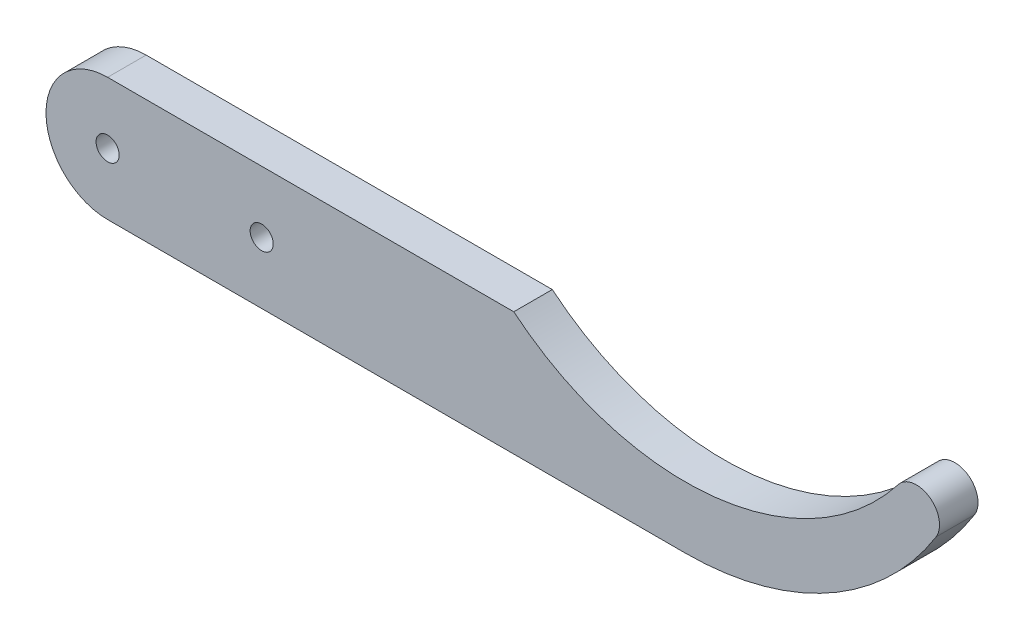
ISO-10303-21;
HEADER;
FILE_DESCRIPTION(('STEP AP214'),'2;1');
FILE_NAME('part.step','',(''),(''),'','','');
FILE_SCHEMA(('AUTOMOTIVE_DESIGN { 1 0 10303 214 1 1 1 1 }'));
ENDSEC;
DATA;
#1=APPLICATION_CONTEXT('core data for automotive mechanical design processes');
#2=APPLICATION_PROTOCOL_DEFINITION('international standard','automotive_design',2000,#1);
#3=PRODUCT_CONTEXT('',#1,'mechanical');
#4=PRODUCT('Part','Part','',(#3));
#5=PRODUCT_RELATED_PRODUCT_CATEGORY('part','',(#4));
#6=PRODUCT_DEFINITION_FORMATION('','',#4);
#7=PRODUCT_DEFINITION_CONTEXT('part definition',#1,'design');
#8=PRODUCT_DEFINITION('design','',#6,#7);
#9=PRODUCT_DEFINITION_SHAPE('','',#8);
#10=(LENGTH_UNIT() NAMED_UNIT(*) SI_UNIT(.MILLI.,.METRE.));
#11=(NAMED_UNIT(*) PLANE_ANGLE_UNIT() SI_UNIT($,.RADIAN.));
#12=(NAMED_UNIT(*) SI_UNIT($,.STERADIAN.) SOLID_ANGLE_UNIT());
#13=UNCERTAINTY_MEASURE_WITH_UNIT(LENGTH_MEASURE(1.E-05),#10,'distance_accuracy_value','');
#14=(GEOMETRIC_REPRESENTATION_CONTEXT(3) GLOBAL_UNCERTAINTY_ASSIGNED_CONTEXT((#13)) GLOBAL_UNIT_ASSIGNED_CONTEXT((#10,
#11,#12)) REPRESENTATION_CONTEXT('',''));
#15=CARTESIAN_POINT('',(0.,0.,0.));
#16=DIRECTION('',(0.,0.,1.));
#17=DIRECTION('',(1.,0.,0.));
#18=AXIS2_PLACEMENT_3D('',#15,#16,#17);
#19=CARTESIAN_POINT('',(-20.,0.,5.));
#20=DIRECTION('',(0.,0.,1.));
#21=DIRECTION('',(1.,0.,0.));
#22=AXIS2_PLACEMENT_3D('',#19,#20,#21);
#23=PLANE('',#22);
#24=CARTESIAN_POINT('',(0.,0.,5.));
#25=DIRECTION('',(0.,0.,1.));
#26=DIRECTION('',(1.,0.,0.));
#27=AXIS2_PLACEMENT_3D('',#24,#25,#26);
#28=CIRCLE('',#27,1.5);
#29=CARTESIAN_POINT('',(1.5,0.,5.));
#30=VERTEX_POINT('',#29);
#31=EDGE_CURVE('E127',#30,#30,#28,.T.);
#32=ORIENTED_EDGE('',*,*,#31,.F.);
#33=EDGE_LOOP('',(#32));
#34=FACE_BOUND('',#33,.T.);
#35=DIRECTION('',(-1.,0.,0.));
#36=VECTOR('',#35,1.);
#37=CARTESIAN_POINT('',(0.,8.,5.));
#38=LINE('',#37,#36);
#39=CARTESIAN_POINT('',(32.7289425486799,8.,5.));
#40=VERTEX_POINT('',#39);
#41=CARTESIAN_POINT('',(-20.,8.,5.));
#42=VERTEX_POINT('',#41);
#43=EDGE_CURVE('E50',#40,#42,#38,.T.);
#44=ORIENTED_EDGE('',*,*,#43,.T.);
#45=CARTESIAN_POINT('',(-20.,0.,5.));
#46=DIRECTION('',(0.,0.,1.));
#47=DIRECTION('',(1.,0.,0.));
#48=AXIS2_PLACEMENT_3D('',#45,#46,#47);
#49=CIRCLE('',#48,8.);
#50=CARTESIAN_POINT('',(-20.,-8.,5.));
#51=VERTEX_POINT('',#50);
#52=EDGE_CURVE('E89',#42,#51,#49,.T.);
#53=ORIENTED_EDGE('',*,*,#52,.T.);
#54=DIRECTION('',(1.,0.,0.));
#55=VECTOR('',#54,1.);
#56=CARTESIAN_POINT('',(0.,-8.,5.));
#57=LINE('',#56,#55);
#58=CARTESIAN_POINT('',(55.,-8.,5.));
#59=VERTEX_POINT('',#58);
#60=EDGE_CURVE('E103',#51,#59,#57,.T.);
#61=ORIENTED_EDGE('',*,*,#60,.T.);
#62=CARTESIAN_POINT('',(55.,30.3226733037957,5.));
#63=DIRECTION('',(0.,0.,1.));
#64=DIRECTION('',(1.,0.,0.));
#65=AXIS2_PLACEMENT_3D('',#62,#63,#64);
#66=CIRCLE('',#65,38.3226733037957);
#67=CARTESIAN_POINT('',(87.5479385216953,10.0925228560754,5.));
#68=VERTEX_POINT('',#67);
#69=EDGE_CURVE('E97',#59,#68,#66,.T.);
#70=ORIENTED_EDGE('',*,*,#69,.T.);
#71=CARTESIAN_POINT('',(85.,11.6761924206188,5.));
#72=DIRECTION('',(0.,0.,1.));
#73=DIRECTION('',(-1.,0.,0.));
#74=AXIS2_PLACEMENT_3D('',#71,#72,#73);
#75=CIRCLE('',#74,3.);
#76=CARTESIAN_POINT('',(82.6315789473684,13.5175456505699,5.));
#77=VERTEX_POINT('',#76);
#78=EDGE_CURVE('E101',#68,#77,#75,.T.);
#79=ORIENTED_EDGE('',*,*,#78,.T.);
#80=CARTESIAN_POINT('',(55.,35.,5.));
#81=DIRECTION('',(0.,0.,-1.));
#82=DIRECTION('',(1.,0.,0.));
#83=AXIS2_PLACEMENT_3D('',#80,#81,#82);
#84=CIRCLE('',#83,35.);
#85=EDGE_CURVE('E117',#77,#40,#84,.T.);
#86=ORIENTED_EDGE('',*,*,#85,.T.);
#87=EDGE_LOOP('',(#44,#53,#61,#70,#79,#86));
#88=FACE_BOUND('',#87,.T.);
#89=CARTESIAN_POINT('',(-20.,0.,5.));
#90=DIRECTION('',(0.,0.,1.));
#91=DIRECTION('',(1.,0.,0.));
#92=AXIS2_PLACEMENT_3D('',#89,#90,#91);
#93=CIRCLE('',#92,1.5);
#94=CARTESIAN_POINT('',(-18.5,0.,5.));
#95=VERTEX_POINT('',#94);
#96=EDGE_CURVE('E173',#95,#95,#93,.T.);
#97=ORIENTED_EDGE('',*,*,#96,.F.);
#98=EDGE_LOOP('',(#97));
#99=FACE_BOUND('',#98,.T.);
#100=ADVANCED_FACE('F33',(#34,#88,#99),#23,.T.);
#101=CARTESIAN_POINT('',(-20.,0.,0.));
#102=DIRECTION('',(0.,0.,1.));
#103=DIRECTION('',(1.,0.,0.));
#104=AXIS2_PLACEMENT_3D('',#101,#102,#103);
#105=PLANE('',#104);
#106=CARTESIAN_POINT('',(0.,0.,0.));
#107=DIRECTION('',(0.,0.,1.));
#108=DIRECTION('',(1.,0.,0.));
#109=AXIS2_PLACEMENT_3D('',#106,#107,#108);
#110=CIRCLE('',#109,1.5);
#111=CARTESIAN_POINT('',(1.5,0.,0.));
#112=VERTEX_POINT('',#111);
#113=EDGE_CURVE('E178',#112,#112,#110,.T.);
#114=ORIENTED_EDGE('',*,*,#113,.T.);
#115=EDGE_LOOP('',(#114));
#116=FACE_BOUND('',#115,.T.);
#117=CARTESIAN_POINT('',(-20.,0.,0.));
#118=DIRECTION('',(0.,0.,1.));
#119=DIRECTION('',(1.,0.,0.));
#120=AXIS2_PLACEMENT_3D('',#117,#118,#119);
#121=CIRCLE('',#120,8.);
#122=CARTESIAN_POINT('',(-20.,8.,0.));
#123=VERTEX_POINT('',#122);
#124=CARTESIAN_POINT('',(-20.,-8.,0.));
#125=VERTEX_POINT('',#124);
#126=EDGE_CURVE('E123',#123,#125,#121,.T.);
#127=ORIENTED_EDGE('',*,*,#126,.F.);
#128=DIRECTION('',(-1.,0.,0.));
#129=VECTOR('',#128,1.);
#130=CARTESIAN_POINT('',(0.,8.,0.));
#131=LINE('',#130,#129);
#132=CARTESIAN_POINT('',(32.7289425486799,8.,0.));
#133=VERTEX_POINT('',#132);
#134=EDGE_CURVE('E81',#133,#123,#131,.T.);
#135=ORIENTED_EDGE('',*,*,#134,.F.);
#136=CARTESIAN_POINT('',(55.,35.,0.));
#137=DIRECTION('',(0.,0.,-1.));
#138=DIRECTION('',(1.,0.,0.));
#139=AXIS2_PLACEMENT_3D('',#136,#137,#138);
#140=CIRCLE('',#139,35.);
#141=CARTESIAN_POINT('',(82.6315789473684,13.5175456505699,0.));
#142=VERTEX_POINT('',#141);
#143=EDGE_CURVE('E131',#142,#133,#140,.T.);
#144=ORIENTED_EDGE('',*,*,#143,.F.);
#145=CARTESIAN_POINT('',(85.,11.6761924206188,0.));
#146=DIRECTION('',(0.,0.,1.));
#147=DIRECTION('',(-1.,0.,0.));
#148=AXIS2_PLACEMENT_3D('',#145,#146,#147);
#149=CIRCLE('',#148,3.);
#150=CARTESIAN_POINT('',(87.5479385216953,10.0925228560754,0.));
#151=VERTEX_POINT('',#150);
#152=EDGE_CURVE('E74',#151,#142,#149,.T.);
#153=ORIENTED_EDGE('',*,*,#152,.F.);
#154=CARTESIAN_POINT('',(55.,30.3226733037957,0.));
#155=DIRECTION('',(0.,0.,1.));
#156=DIRECTION('',(1.,0.,0.));
#157=AXIS2_PLACEMENT_3D('',#154,#155,#156);
#158=CIRCLE('',#157,38.3226733037957);
#159=CARTESIAN_POINT('',(55.,-8.,0.));
#160=VERTEX_POINT('',#159);
#161=EDGE_CURVE('E111',#160,#151,#158,.T.);
#162=ORIENTED_EDGE('',*,*,#161,.F.);
#163=DIRECTION('',(1.,0.,0.));
#164=VECTOR('',#163,1.);
#165=CARTESIAN_POINT('',(0.,-8.,0.));
#166=LINE('',#165,#164);
#167=EDGE_CURVE('E126',#125,#160,#166,.T.);
#168=ORIENTED_EDGE('',*,*,#167,.F.);
#169=EDGE_LOOP('',(#127,#135,#144,#153,#162,#168));
#170=FACE_BOUND('',#169,.T.);
#171=CARTESIAN_POINT('',(-20.,0.,0.));
#172=DIRECTION('',(0.,0.,1.));
#173=DIRECTION('',(1.,0.,0.));
#174=AXIS2_PLACEMENT_3D('',#171,#172,#173);
#175=CIRCLE('',#174,1.5);
#176=CARTESIAN_POINT('',(-18.5,0.,0.));
#177=VERTEX_POINT('',#176);
#178=EDGE_CURVE('E176',#177,#177,#175,.T.);
#179=ORIENTED_EDGE('',*,*,#178,.T.);
#180=EDGE_LOOP('',(#179));
#181=FACE_BOUND('',#180,.T.);
#182=ADVANCED_FACE('F139',(#116,#170,#181),#105,.F.);
#183=CARTESIAN_POINT('',(-20.,0.,5.));
#184=DIRECTION('',(0.,0.,-1.));
#185=DIRECTION('',(-1.,0.,0.));
#186=AXIS2_PLACEMENT_3D('',#183,#184,#185);
#187=CYLINDRICAL_SURFACE('',#186,8.);
#188=ORIENTED_EDGE('',*,*,#126,.T.);
#189=DIRECTION('',(0.,0.,-1.));
#190=VECTOR('',#189,1.);
#191=CARTESIAN_POINT('',(-20.,-8.,5.));
#192=LINE('',#191,#190);
#193=EDGE_CURVE('E42',#51,#125,#192,.T.);
#194=ORIENTED_EDGE('',*,*,#193,.F.);
#195=ORIENTED_EDGE('',*,*,#52,.F.);
#196=DIRECTION('',(0.,0.,-1.));
#197=VECTOR('',#196,1.);
#198=CARTESIAN_POINT('',(-20.,8.,5.));
#199=LINE('',#198,#197);
#200=EDGE_CURVE('E11',#42,#123,#199,.T.);
#201=ORIENTED_EDGE('',*,*,#200,.T.);
#202=EDGE_LOOP('',(#188,#194,#195,#201));
#203=FACE_BOUND('',#202,.T.);
#204=ADVANCED_FACE('F35',(#203),#187,.T.);
#205=CARTESIAN_POINT('',(0.,-8.,5.));
#206=DIRECTION('',(0.,1.,0.));
#207=DIRECTION('',(0.,0.,1.));
#208=AXIS2_PLACEMENT_3D('',#205,#206,#207);
#209=PLANE('',#208);
#210=ORIENTED_EDGE('',*,*,#167,.T.);
#211=DIRECTION('',(0.,0.,-1.));
#212=VECTOR('',#211,1.);
#213=CARTESIAN_POINT('',(55.,-8.,5.));
#214=LINE('',#213,#212);
#215=EDGE_CURVE('E112',#59,#160,#214,.T.);
#216=ORIENTED_EDGE('',*,*,#215,.F.);
#217=ORIENTED_EDGE('',*,*,#60,.F.);
#218=ORIENTED_EDGE('',*,*,#193,.T.);
#219=EDGE_LOOP('',(#210,#216,#217,#218));
#220=FACE_BOUND('',#219,.T.);
#221=ADVANCED_FACE('F138',(#220),#209,.F.);
#222=CARTESIAN_POINT('',(55.,30.3226733037957,5.));
#223=DIRECTION('',(0.,0.,-1.));
#224=DIRECTION('',(-1.,0.,0.));
#225=AXIS2_PLACEMENT_3D('',#222,#223,#224);
#226=CYLINDRICAL_SURFACE('',#225,38.3226733037957);
#227=ORIENTED_EDGE('',*,*,#161,.T.);
#228=DIRECTION('',(0.,0.,-1.));
#229=VECTOR('',#228,1.);
#230=CARTESIAN_POINT('',(87.5479385216953,10.0925228560754,5.));
#231=LINE('',#230,#229);
#232=EDGE_CURVE('E108',#68,#151,#231,.T.);
#233=ORIENTED_EDGE('',*,*,#232,.F.);
#234=ORIENTED_EDGE('',*,*,#69,.F.);
#235=ORIENTED_EDGE('',*,*,#215,.T.);
#236=EDGE_LOOP('',(#227,#233,#234,#235));
#237=FACE_BOUND('',#236,.T.);
#238=ADVANCED_FACE('F109',(#237),#226,.T.);
#239=CARTESIAN_POINT('',(85.,11.6761924206188,5.));
#240=DIRECTION('',(0.,0.,-1.));
#241=DIRECTION('',(-1.,0.,0.));
#242=AXIS2_PLACEMENT_3D('',#239,#240,#241);
#243=CYLINDRICAL_SURFACE('',#242,3.);
#244=ORIENTED_EDGE('',*,*,#152,.T.);
#245=DIRECTION('',(0.,0.,-1.));
#246=VECTOR('',#245,1.);
#247=CARTESIAN_POINT('',(82.6315789473684,13.5175456505699,5.));
#248=LINE('',#247,#246);
#249=EDGE_CURVE('E113',#77,#142,#248,.T.);
#250=ORIENTED_EDGE('',*,*,#249,.F.);
#251=ORIENTED_EDGE('',*,*,#78,.F.);
#252=ORIENTED_EDGE('',*,*,#232,.T.);
#253=EDGE_LOOP('',(#244,#250,#251,#252));
#254=FACE_BOUND('',#253,.T.);
#255=ADVANCED_FACE('F115',(#254),#243,.T.);
#256=CARTESIAN_POINT('',(55.,35.,5.));
#257=DIRECTION('',(0.,0.,-1.));
#258=DIRECTION('',(-1.,0.,0.));
#259=AXIS2_PLACEMENT_3D('',#256,#257,#258);
#260=CYLINDRICAL_SURFACE('',#259,35.);
#261=ORIENTED_EDGE('',*,*,#143,.T.);
#262=DIRECTION('',(0.,0.,-1.));
#263=VECTOR('',#262,1.);
#264=CARTESIAN_POINT('',(32.7289425486799,8.,5.));
#265=LINE('',#264,#263);
#266=EDGE_CURVE('E119',#40,#133,#265,.T.);
#267=ORIENTED_EDGE('',*,*,#266,.F.);
#268=ORIENTED_EDGE('',*,*,#85,.F.);
#269=ORIENTED_EDGE('',*,*,#249,.T.);
#270=EDGE_LOOP('',(#261,#267,#268,#269));
#271=FACE_BOUND('',#270,.T.);
#272=ADVANCED_FACE('F143',(#271),#260,.F.);
#273=CARTESIAN_POINT('',(0.,8.,5.));
#274=DIRECTION('',(0.,-1.,0.));
#275=DIRECTION('',(0.,0.,-1.));
#276=AXIS2_PLACEMENT_3D('',#273,#274,#275);
#277=PLANE('',#276);
#278=ORIENTED_EDGE('',*,*,#134,.T.);
#279=ORIENTED_EDGE('',*,*,#200,.F.);
#280=ORIENTED_EDGE('',*,*,#43,.F.);
#281=ORIENTED_EDGE('',*,*,#266,.T.);
#282=EDGE_LOOP('',(#278,#279,#280,#281));
#283=FACE_BOUND('',#282,.T.);
#284=ADVANCED_FACE('F144',(#283),#277,.F.);
#285=CARTESIAN_POINT('',(0.,0.,5.));
#286=DIRECTION('',(0.,0.,-1.));
#287=DIRECTION('',(-1.,0.,0.));
#288=AXIS2_PLACEMENT_3D('',#285,#286,#287);
#289=CYLINDRICAL_SURFACE('',#288,1.5);
#290=ORIENTED_EDGE('',*,*,#31,.T.);
#291=EDGE_LOOP('',(#290));
#292=FACE_BOUND('',#291,.T.);
#293=ORIENTED_EDGE('',*,*,#113,.F.);
#294=EDGE_LOOP('',(#293));
#295=FACE_BOUND('',#294,.T.);
#296=ADVANCED_FACE('F146',(#292,#295),#289,.F.);
#297=CARTESIAN_POINT('',(-20.,0.,5.));
#298=DIRECTION('',(0.,0.,-1.));
#299=DIRECTION('',(-1.,0.,0.));
#300=AXIS2_PLACEMENT_3D('',#297,#298,#299);
#301=CYLINDRICAL_SURFACE('',#300,1.5);
#302=ORIENTED_EDGE('',*,*,#96,.T.);
#303=EDGE_LOOP('',(#302));
#304=FACE_BOUND('',#303,.T.);
#305=ORIENTED_EDGE('',*,*,#178,.F.);
#306=EDGE_LOOP('',(#305));
#307=FACE_BOUND('',#306,.T.);
#308=ADVANCED_FACE('F152',(#304,#307),#301,.F.);
#309=CLOSED_SHELL('',(#100,#182,#204,#221,#238,#255,#272,#284,#296,#308));
#310=MANIFOLD_SOLID_BREP('B2',#309);
#311=ADVANCED_BREP_SHAPE_REPRESENTATION('',(#18,#310),#14);
#312=SHAPE_DEFINITION_REPRESENTATION(#9,#311);
ENDSEC;
END-ISO-10303-21;
